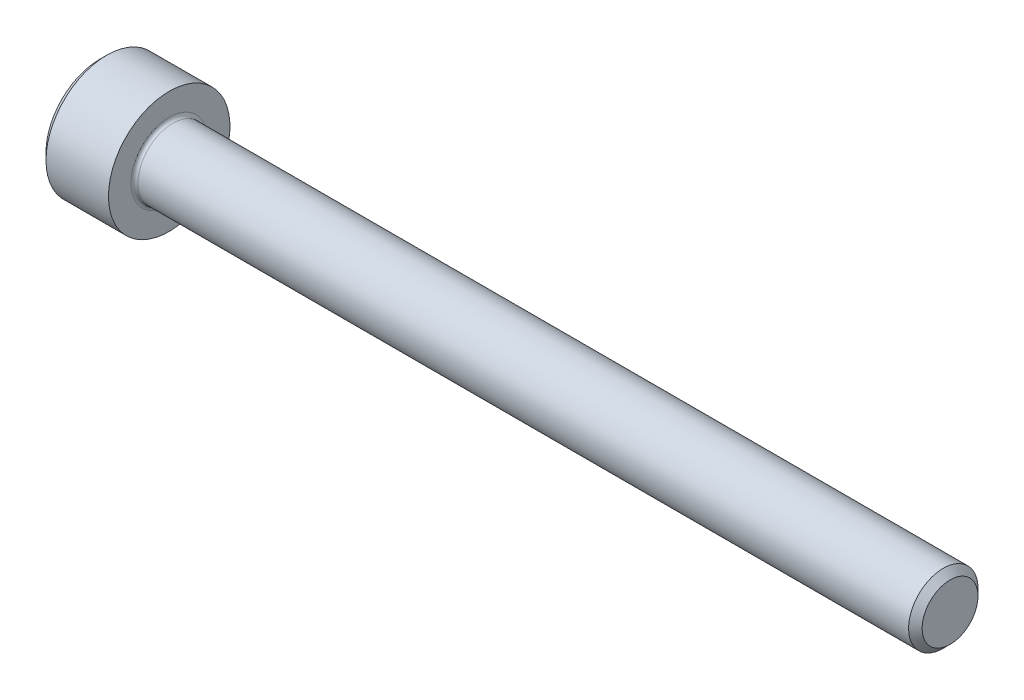
ISO-10303-21;
HEADER;
FILE_DESCRIPTION(('STEP AP214'),'2;1');
FILE_NAME('part.step','',(''),(''),'','','');
FILE_SCHEMA(('AUTOMOTIVE_DESIGN { 1 0 10303 214 1 1 1 1 }'));
ENDSEC;
DATA;
#1=APPLICATION_CONTEXT('core data for automotive mechanical design processes');
#2=APPLICATION_PROTOCOL_DEFINITION('international standard','automotive_design',2000,#1);
#3=PRODUCT_CONTEXT('',#1,'mechanical');
#4=PRODUCT('Part','Part','',(#3));
#5=PRODUCT_RELATED_PRODUCT_CATEGORY('part','',(#4));
#6=PRODUCT_DEFINITION_FORMATION('','',#4);
#7=PRODUCT_DEFINITION_CONTEXT('part definition',#1,'design');
#8=PRODUCT_DEFINITION('design','',#6,#7);
#9=PRODUCT_DEFINITION_SHAPE('','',#8);
#10=(LENGTH_UNIT() NAMED_UNIT(*) SI_UNIT(.MILLI.,.METRE.));
#11=(NAMED_UNIT(*) PLANE_ANGLE_UNIT() SI_UNIT($,.RADIAN.));
#12=(NAMED_UNIT(*) SI_UNIT($,.STERADIAN.) SOLID_ANGLE_UNIT());
#13=UNCERTAINTY_MEASURE_WITH_UNIT(LENGTH_MEASURE(1.E-05),#10,'distance_accuracy_value','');
#14=(GEOMETRIC_REPRESENTATION_CONTEXT(3) GLOBAL_UNCERTAINTY_ASSIGNED_CONTEXT((#13)) GLOBAL_UNIT_ASSIGNED_CONTEXT((#10,
#11,#12)) REPRESENTATION_CONTEXT('',''));
#15=CARTESIAN_POINT('',(0.,0.,0.));
#16=DIRECTION('',(0.,0.,1.));
#17=DIRECTION('',(1.,0.,0.));
#18=AXIS2_PLACEMENT_3D('',#15,#16,#17);
#19=CARTESIAN_POINT('',(2.00000000012324,0.,0.));
#20=DIRECTION('',(-1.,0.,0.));
#21=DIRECTION('',(0.,0.,1.));
#22=AXIS2_PLACEMENT_3D('',#19,#20,#21);
#23=CONICAL_SURFACE('',#22,1.53549999976121,1.04719755097356);
#24=CARTESIAN_POINT('',(2.88652133838241,0.,3.12638803734444E-10));
#25=VERTEX_POINT('',#24);
#26=VERTEX_LOOP('',#25);
#27=FACE_BOUND('',#26,.T.);
#28=CARTESIAN_POINT('',(1.99999999999196,0.,0.));
#29=DIRECTION('',(-1.,0.,0.));
#30=DIRECTION('',(0.,0.,1.));
#31=AXIS2_PLACEMENT_3D('',#28,#29,#30);
#32=CIRCLE('',#31,1.53549999998859);
#33=CARTESIAN_POINT('',(1.99999999999837,0.,1.53549999999715));
#34=VERTEX_POINT('',#33);
#35=CARTESIAN_POINT('',(1.99999999999598,-1.32978200750606,0.767749999997149));
#36=VERTEX_POINT('',#35);
#37=EDGE_CURVE('E96',#34,#36,#32,.F.);
#38=ORIENTED_EDGE('',*,*,#37,.F.);
#39=CARTESIAN_POINT('',(1.99999999999196,0.,0.));
#40=DIRECTION('',(-1.,0.,0.));
#41=DIRECTION('',(0.,0.,1.));
#42=AXIS2_PLACEMENT_3D('',#39,#40,#41);
#43=CIRCLE('',#42,1.53549999998859);
#44=CARTESIAN_POINT('',(1.99999999999598,1.32978200750606,0.767749999997144));
#45=VERTEX_POINT('',#44);
#46=EDGE_CURVE('E99',#45,#34,#43,.F.);
#47=ORIENTED_EDGE('',*,*,#46,.F.);
#48=CARTESIAN_POINT('',(1.99999999999196,0.,0.));
#49=DIRECTION('',(-1.,0.,0.));
#50=DIRECTION('',(0.,0.,1.));
#51=AXIS2_PLACEMENT_3D('',#48,#49,#50);
#52=CIRCLE('',#51,1.53549999998859);
#53=CARTESIAN_POINT('',(1.99999999999598,1.32978200750606,-0.767749999997148));
#54=VERTEX_POINT('',#53);
#55=EDGE_CURVE('E121',#54,#45,#52,.F.);
#56=ORIENTED_EDGE('',*,*,#55,.F.);
#57=CARTESIAN_POINT('',(1.99999999999196,0.,0.));
#58=DIRECTION('',(-1.,0.,0.));
#59=DIRECTION('',(0.,0.,1.));
#60=AXIS2_PLACEMENT_3D('',#57,#58,#59);
#61=CIRCLE('',#60,1.53549999998859);
#62=CARTESIAN_POINT('',(1.99999999999837,0.,-1.53549999999144));
#63=VERTEX_POINT('',#62);
#64=EDGE_CURVE('E155',#63,#54,#61,.F.);
#65=ORIENTED_EDGE('',*,*,#64,.F.);
#66=CARTESIAN_POINT('',(1.99999999999196,0.,0.));
#67=DIRECTION('',(-1.,0.,0.));
#68=DIRECTION('',(0.,0.,1.));
#69=AXIS2_PLACEMENT_3D('',#66,#67,#68);
#70=CIRCLE('',#69,1.53549999998859);
#71=CARTESIAN_POINT('',(1.99999999999598,-1.32978200750607,-0.767749999997147));
#72=VERTEX_POINT('',#71);
#73=EDGE_CURVE('E122',#72,#63,#70,.F.);
#74=ORIENTED_EDGE('',*,*,#73,.F.);
#75=CARTESIAN_POINT('',(1.99999999999196,0.,0.));
#76=DIRECTION('',(-1.,0.,0.));
#77=DIRECTION('',(0.,0.,1.));
#78=AXIS2_PLACEMENT_3D('',#75,#76,#77);
#79=CIRCLE('',#78,1.53549999998859);
#80=EDGE_CURVE('E102',#36,#72,#79,.F.);
#81=ORIENTED_EDGE('',*,*,#80,.F.);
#82=EDGE_LOOP('',(#38,#47,#56,#65,#74,#81));
#83=FACE_BOUND('',#82,.T.);
#84=ADVANCED_FACE('F17',(#27,#83),#23,.F.);
#85=CARTESIAN_POINT('',(2.,0.886521338340669,1.5355));
#86=DIRECTION('',(-1.,0.,0.));
#87=DIRECTION('',(0.,0.,1.));
#88=AXIS2_PLACEMENT_3D('',#85,#86,#87);
#89=PLANE('',#88);
#90=DIRECTION('',(0.,-1.,0.));
#91=VECTOR('',#90,1.);
#92=CARTESIAN_POINT('',(2.,-0.886521338340672,1.5355));
#93=LINE('',#92,#91);
#94=CARTESIAN_POINT('',(2.,0.88652133834067,1.5355));
#95=VERTEX_POINT('',#94);
#96=EDGE_CURVE('E113',#34,#95,#93,.F.);
#97=ORIENTED_EDGE('',*,*,#96,.T.);
#98=DIRECTION('',(0.,0.499999999999999,-0.86602540378444));
#99=VECTOR('',#98,1.);
#100=CARTESIAN_POINT('',(2.,1.77304267668134,0.));
#101=LINE('',#100,#99);
#102=EDGE_CURVE('E114',#45,#95,#101,.F.);
#103=ORIENTED_EDGE('',*,*,#102,.F.);
#104=ORIENTED_EDGE('',*,*,#46,.T.);
#105=EDGE_LOOP('',(#97,#103,#104));
#106=FACE_BOUND('',#105,.T.);
#107=ADVANCED_FACE('F118',(#106),#89,.T.);
#108=CARTESIAN_POINT('',(2.,0.886521338340669,1.5355));
#109=DIRECTION('',(-1.,0.,0.));
#110=DIRECTION('',(0.,0.,1.));
#111=AXIS2_PLACEMENT_3D('',#108,#109,#110);
#112=PLANE('',#111);
#113=DIRECTION('',(0.,0.500000000000001,0.866025403784438));
#114=VECTOR('',#113,1.);
#115=CARTESIAN_POINT('',(2.,-0.886521338340672,1.5355));
#116=LINE('',#115,#114);
#117=CARTESIAN_POINT('',(2.,-0.886521338340672,1.5355));
#118=VERTEX_POINT('',#117);
#119=EDGE_CURVE('E109',#118,#36,#116,.F.);
#120=ORIENTED_EDGE('',*,*,#119,.F.);
#121=DIRECTION('',(0.,-1.,0.));
#122=VECTOR('',#121,1.);
#123=CARTESIAN_POINT('',(2.,-0.886521338340672,1.5355));
#124=LINE('',#123,#122);
#125=EDGE_CURVE('E107',#118,#34,#124,.F.);
#126=ORIENTED_EDGE('',*,*,#125,.T.);
#127=ORIENTED_EDGE('',*,*,#37,.T.);
#128=EDGE_LOOP('',(#120,#126,#127));
#129=FACE_BOUND('',#128,.T.);
#130=ADVANCED_FACE('F108',(#129),#112,.T.);
#131=CARTESIAN_POINT('',(2.,0.886521338340669,1.5355));
#132=DIRECTION('',(-1.,0.,0.));
#133=DIRECTION('',(0.,0.,1.));
#134=AXIS2_PLACEMENT_3D('',#131,#132,#133);
#135=PLANE('',#134);
#136=DIRECTION('',(0.,-0.499999999999999,0.86602540378444));
#137=VECTOR('',#136,1.);
#138=CARTESIAN_POINT('',(2.,-1.77304267668134,0.));
#139=LINE('',#138,#137);
#140=CARTESIAN_POINT('',(2.,-1.77304267668134,0.));
#141=VERTEX_POINT('',#140);
#142=EDGE_CURVE('E415',#141,#72,#139,.F.);
#143=ORIENTED_EDGE('',*,*,#142,.F.);
#144=DIRECTION('',(0.,0.500000000000001,0.866025403784438));
#145=VECTOR('',#144,1.);
#146=CARTESIAN_POINT('',(2.,-0.886521338340672,1.5355));
#147=LINE('',#146,#145);
#148=EDGE_CURVE('E417',#36,#141,#147,.F.);
#149=ORIENTED_EDGE('',*,*,#148,.F.);
#150=ORIENTED_EDGE('',*,*,#80,.T.);
#151=EDGE_LOOP('',(#143,#149,#150));
#152=FACE_BOUND('',#151,.T.);
#153=ADVANCED_FACE('F276',(#152),#135,.T.);
#154=CARTESIAN_POINT('',(2.,0.886521338340669,1.5355));
#155=DIRECTION('',(-1.,0.,0.));
#156=DIRECTION('',(0.,0.,1.));
#157=AXIS2_PLACEMENT_3D('',#154,#155,#156);
#158=PLANE('',#157);
#159=DIRECTION('',(0.,1.,0.));
#160=VECTOR('',#159,1.);
#161=CARTESIAN_POINT('',(2.,0.886521338340665,-1.5355));
#162=LINE('',#161,#160);
#163=CARTESIAN_POINT('',(2.,-0.886521338340676,-1.5355));
#164=VERTEX_POINT('',#163);
#165=EDGE_CURVE('E471',#63,#164,#162,.F.);
#166=ORIENTED_EDGE('',*,*,#165,.T.);
#167=DIRECTION('',(0.,-0.499999999999999,0.86602540378444));
#168=VECTOR('',#167,1.);
#169=CARTESIAN_POINT('',(2.,-1.77304267668134,0.));
#170=LINE('',#169,#168);
#171=EDGE_CURVE('E420',#72,#164,#170,.F.);
#172=ORIENTED_EDGE('',*,*,#171,.F.);
#173=ORIENTED_EDGE('',*,*,#73,.T.);
#174=EDGE_LOOP('',(#166,#172,#173));
#175=FACE_BOUND('',#174,.T.);
#176=ADVANCED_FACE('F272',(#175),#158,.T.);
#177=CARTESIAN_POINT('',(2.,0.886521338340669,1.5355));
#178=DIRECTION('',(-1.,0.,0.));
#179=DIRECTION('',(0.,0.,1.));
#180=AXIS2_PLACEMENT_3D('',#177,#178,#179);
#181=PLANE('',#180);
#182=DIRECTION('',(0.,0.499999999999999,-0.86602540378444));
#183=VECTOR('',#182,1.);
#184=CARTESIAN_POINT('',(2.,1.77304267668134,0.));
#185=LINE('',#184,#183);
#186=CARTESIAN_POINT('',(2.,1.77304267668134,0.));
#187=VERTEX_POINT('',#186);
#188=EDGE_CURVE('E138',#187,#45,#185,.F.);
#189=ORIENTED_EDGE('',*,*,#188,.F.);
#190=DIRECTION('',(0.,0.500000000000001,0.866025403784438));
#191=VECTOR('',#190,1.);
#192=CARTESIAN_POINT('',(2.,1.77304267668134,0.));
#193=LINE('',#192,#191);
#194=EDGE_CURVE('E486',#187,#54,#193,.F.);
#195=ORIENTED_EDGE('',*,*,#194,.T.);
#196=ORIENTED_EDGE('',*,*,#55,.T.);
#197=EDGE_LOOP('',(#189,#195,#196));
#198=FACE_BOUND('',#197,.T.);
#199=ADVANCED_FACE('F268',(#198),#181,.T.);
#200=CARTESIAN_POINT('',(2.,0.886521338340669,1.5355));
#201=DIRECTION('',(-1.,0.,0.));
#202=DIRECTION('',(0.,0.,1.));
#203=AXIS2_PLACEMENT_3D('',#200,#201,#202);
#204=PLANE('',#203);
#205=DIRECTION('',(0.,0.500000000000001,0.866025403784438));
#206=VECTOR('',#205,1.);
#207=CARTESIAN_POINT('',(2.,1.77304267668134,0.));
#208=LINE('',#207,#206);
#209=CARTESIAN_POINT('',(2.,0.886521338340665,-1.5355));
#210=VERTEX_POINT('',#209);
#211=EDGE_CURVE('E460',#54,#210,#208,.F.);
#212=ORIENTED_EDGE('',*,*,#211,.T.);
#213=DIRECTION('',(0.,1.,0.));
#214=VECTOR('',#213,1.);
#215=CARTESIAN_POINT('',(2.,0.886521338340665,-1.5355));
#216=LINE('',#215,#214);
#217=EDGE_CURVE('E474',#210,#63,#216,.F.);
#218=ORIENTED_EDGE('',*,*,#217,.T.);
#219=ORIENTED_EDGE('',*,*,#64,.T.);
#220=EDGE_LOOP('',(#212,#218,#219));
#221=FACE_BOUND('',#220,.T.);
#222=ADVANCED_FACE('F264',(#221),#204,.T.);
#223=CARTESIAN_POINT('',(2.,1.77304267668134,0.));
#224=DIRECTION('',(0.,-0.86602540378444,-0.499999999999999));
#225=DIRECTION('',(0.,0.499999999999999,-0.86602540378444));
#226=AXIS2_PLACEMENT_3D('',#223,#224,#225);
#227=PLANE('',#226);
#228=ORIENTED_EDGE('',*,*,#102,.T.);
#229=DIRECTION('',(1.,0.,0.));
#230=VECTOR('',#229,1.);
#231=CARTESIAN_POINT('',(2.,0.88652133834067,1.5355));
#232=LINE('',#231,#230);
#233=CARTESIAN_POINT('',(0.,0.88652133834067,1.5355));
#234=VERTEX_POINT('',#233);
#235=EDGE_CURVE('E127',#95,#234,#232,.F.);
#236=ORIENTED_EDGE('',*,*,#235,.T.);
#237=DIRECTION('',(0.,-0.499999999999999,0.866025403784439));
#238=VECTOR('',#237,1.);
#239=CARTESIAN_POINT('',(0.,1.77304267668134,0.));
#240=LINE('',#239,#238);
#241=CARTESIAN_POINT('',(0.,1.77304267668134,0.));
#242=VERTEX_POINT('',#241);
#243=EDGE_CURVE('E454',#242,#234,#240,.T.);
#244=ORIENTED_EDGE('',*,*,#243,.F.);
#245=DIRECTION('',(1.,0.,0.));
#246=VECTOR('',#245,1.);
#247=CARTESIAN_POINT('',(2.,1.77304267668134,0.));
#248=LINE('',#247,#246);
#249=EDGE_CURVE('E481',#242,#187,#248,.T.);
#250=ORIENTED_EDGE('',*,*,#249,.T.);
#251=ORIENTED_EDGE('',*,*,#188,.T.);
#252=EDGE_LOOP('',(#228,#236,#244,#250,#251));
#253=FACE_BOUND('',#252,.T.);
#254=ADVANCED_FACE('F261',(#253),#227,.T.);
#255=CARTESIAN_POINT('',(2.,-0.886521338340672,1.5355));
#256=DIRECTION('',(0.,0.,1.));
#257=DIRECTION('',(0.,-1.,0.));
#258=AXIS2_PLACEMENT_3D('',#255,#256,#257);
#259=PLANE('',#258);
#260=ORIENTED_EDGE('',*,*,#235,.F.);
#261=ORIENTED_EDGE('',*,*,#96,.F.);
#262=ORIENTED_EDGE('',*,*,#125,.F.);
#263=DIRECTION('',(1.,0.,0.));
#264=VECTOR('',#263,1.);
#265=CARTESIAN_POINT('',(2.,-0.886521338340672,1.5355));
#266=LINE('',#265,#264);
#267=CARTESIAN_POINT('',(0.,-0.886521338340672,1.5355));
#268=VERTEX_POINT('',#267);
#269=EDGE_CURVE('E129',#268,#118,#266,.T.);
#270=ORIENTED_EDGE('',*,*,#269,.F.);
#271=DIRECTION('',(0.,1.,0.));
#272=VECTOR('',#271,1.);
#273=CARTESIAN_POINT('',(0.,0.,1.5355));
#274=LINE('',#273,#272);
#275=EDGE_CURVE('E443',#234,#268,#274,.F.);
#276=ORIENTED_EDGE('',*,*,#275,.F.);
#277=EDGE_LOOP('',(#260,#261,#262,#270,#276));
#278=FACE_BOUND('',#277,.T.);
#279=ADVANCED_FACE('F125',(#278),#259,.F.);
#280=CARTESIAN_POINT('',(2.,-0.886521338340672,1.5355));
#281=DIRECTION('',(0.,0.866025403784438,-0.500000000000001));
#282=DIRECTION('',(0.,0.500000000000001,0.866025403784438));
#283=AXIS2_PLACEMENT_3D('',#280,#281,#282);
#284=PLANE('',#283);
#285=ORIENTED_EDGE('',*,*,#148,.T.);
#286=DIRECTION('',(1.,0.,0.));
#287=VECTOR('',#286,1.);
#288=CARTESIAN_POINT('',(2.,-1.77304267668134,0.));
#289=LINE('',#288,#287);
#290=CARTESIAN_POINT('',(0.,-1.77304267668134,0.));
#291=VERTEX_POINT('',#290);
#292=EDGE_CURVE('E421',#291,#141,#289,.T.);
#293=ORIENTED_EDGE('',*,*,#292,.F.);
#294=DIRECTION('',(0.,-0.500000000000001,-0.866025403784438));
#295=VECTOR('',#294,1.);
#296=CARTESIAN_POINT('',(0.,-0.886521338340672,1.5355));
#297=LINE('',#296,#295);
#298=EDGE_CURVE('E439',#268,#291,#297,.T.);
#299=ORIENTED_EDGE('',*,*,#298,.F.);
#300=ORIENTED_EDGE('',*,*,#269,.T.);
#301=ORIENTED_EDGE('',*,*,#119,.T.);
#302=EDGE_LOOP('',(#285,#293,#299,#300,#301));
#303=FACE_BOUND('',#302,.T.);
#304=ADVANCED_FACE('F254',(#303),#284,.T.);
#305=CARTESIAN_POINT('',(2.,-1.77304267668134,0.));
#306=DIRECTION('',(0.,0.86602540378444,0.499999999999999));
#307=DIRECTION('',(0.,-0.499999999999999,0.86602540378444));
#308=AXIS2_PLACEMENT_3D('',#305,#306,#307);
#309=PLANE('',#308);
#310=ORIENTED_EDGE('',*,*,#171,.T.);
#311=DIRECTION('',(1.,0.,0.));
#312=VECTOR('',#311,1.);
#313=CARTESIAN_POINT('',(2.,-0.886521338340676,-1.5355));
#314=LINE('',#313,#312);
#315=CARTESIAN_POINT('',(0.,-0.886521338340676,-1.5355));
#316=VERTEX_POINT('',#315);
#317=EDGE_CURVE('E473',#164,#316,#314,.F.);
#318=ORIENTED_EDGE('',*,*,#317,.T.);
#319=DIRECTION('',(0.,0.499999999999999,-0.86602540378444));
#320=VECTOR('',#319,1.);
#321=CARTESIAN_POINT('',(0.,-1.77304267668134,0.));
#322=LINE('',#321,#320);
#323=EDGE_CURVE('E425',#291,#316,#322,.T.);
#324=ORIENTED_EDGE('',*,*,#323,.F.);
#325=ORIENTED_EDGE('',*,*,#292,.T.);
#326=ORIENTED_EDGE('',*,*,#142,.T.);
#327=EDGE_LOOP('',(#310,#318,#324,#325,#326));
#328=FACE_BOUND('',#327,.T.);
#329=ADVANCED_FACE('F250',(#328),#309,.T.);
#330=CARTESIAN_POINT('',(2.,0.886521338340665,-1.5355));
#331=DIRECTION('',(0.,0.,-1.));
#332=DIRECTION('',(0.,1.,0.));
#333=AXIS2_PLACEMENT_3D('',#330,#331,#332);
#334=PLANE('',#333);
#335=ORIENTED_EDGE('',*,*,#317,.F.);
#336=ORIENTED_EDGE('',*,*,#165,.F.);
#337=ORIENTED_EDGE('',*,*,#217,.F.);
#338=DIRECTION('',(1.,0.,0.));
#339=VECTOR('',#338,1.);
#340=CARTESIAN_POINT('',(2.,0.886521338340665,-1.5355));
#341=LINE('',#340,#339);
#342=CARTESIAN_POINT('',(0.,0.886521338340666,-1.5355));
#343=VERTEX_POINT('',#342);
#344=EDGE_CURVE('E457',#210,#343,#341,.F.);
#345=ORIENTED_EDGE('',*,*,#344,.T.);
#346=DIRECTION('',(0.,1.,0.));
#347=VECTOR('',#346,1.);
#348=CARTESIAN_POINT('',(0.,0.,-1.5355));
#349=LINE('',#348,#347);
#350=EDGE_CURVE('E438',#316,#343,#349,.T.);
#351=ORIENTED_EDGE('',*,*,#350,.F.);
#352=EDGE_LOOP('',(#335,#336,#337,#345,#351));
#353=FACE_BOUND('',#352,.T.);
#354=ADVANCED_FACE('F246',(#353),#334,.F.);
#355=CARTESIAN_POINT('',(2.,1.77304267668134,0.));
#356=DIRECTION('',(0.,0.866025403784438,-0.500000000000001));
#357=DIRECTION('',(0.,0.500000000000001,0.866025403784438));
#358=AXIS2_PLACEMENT_3D('',#355,#356,#357);
#359=PLANE('',#358);
#360=ORIENTED_EDGE('',*,*,#344,.F.);
#361=ORIENTED_EDGE('',*,*,#211,.F.);
#362=ORIENTED_EDGE('',*,*,#194,.F.);
#363=ORIENTED_EDGE('',*,*,#249,.F.);
#364=DIRECTION('',(0.,0.500000000000001,0.866025403784438));
#365=VECTOR('',#364,1.);
#366=CARTESIAN_POINT('',(0.,0.886521338340665,-1.5355));
#367=LINE('',#366,#365);
#368=EDGE_CURVE('E154',#343,#242,#367,.T.);
#369=ORIENTED_EDGE('',*,*,#368,.F.);
#370=EDGE_LOOP('',(#360,#361,#362,#363,#369));
#371=FACE_BOUND('',#370,.T.);
#372=ADVANCED_FACE('F242',(#371),#359,.F.);
#373=CARTESIAN_POINT('',(0.,0.,0.));
#374=DIRECTION('',(-1.,0.,0.));
#375=DIRECTION('',(0.,0.,1.));
#376=AXIS2_PLACEMENT_3D('',#373,#374,#375);
#377=PLANE('',#376);
#378=CARTESIAN_POINT('',(0.,0.,0.));
#379=DIRECTION('',(1.,0.,0.));
#380=DIRECTION('',(0.,0.,-1.));
#381=AXIS2_PLACEMENT_3D('',#378,#379,#380);
#382=CIRCLE('',#381,3.10000000007449);
#383=CARTESIAN_POINT('',(0.,0.,-3.10000000007449));
#384=VERTEX_POINT('',#383);
#385=EDGE_CURVE('E151',#384,#384,#382,.T.);
#386=ORIENTED_EDGE('',*,*,#385,.F.);
#387=EDGE_LOOP('',(#386));
#388=FACE_BOUND('',#387,.T.);
#389=ORIENTED_EDGE('',*,*,#350,.T.);
#390=ORIENTED_EDGE('',*,*,#368,.T.);
#391=ORIENTED_EDGE('',*,*,#243,.T.);
#392=ORIENTED_EDGE('',*,*,#275,.T.);
#393=ORIENTED_EDGE('',*,*,#298,.T.);
#394=ORIENTED_EDGE('',*,*,#323,.T.);
#395=EDGE_LOOP('',(#389,#390,#391,#392,#393,#394));
#396=FACE_BOUND('',#395,.T.);
#397=ADVANCED_FACE('F234',(#388,#396),#377,.T.);
#398=CARTESIAN_POINT('',(0.400000000013279,0.,0.));
#399=DIRECTION('',(1.,0.,0.));
#400=DIRECTION('',(0.,0.,-1.));
#401=AXIS2_PLACEMENT_3D('',#398,#399,#400);
#402=CONICAL_SURFACE('',#401,3.50000000003092,0.785398163326394);
#403=ORIENTED_EDGE('',*,*,#385,.T.);
#404=EDGE_LOOP('',(#403));
#405=FACE_BOUND('',#404,.T.);
#406=CARTESIAN_POINT('',(0.399999999999998,0.,0.));
#407=DIRECTION('',(-1.,0.,0.));
#408=DIRECTION('',(0.,0.,1.));
#409=AXIS2_PLACEMENT_3D('',#406,#407,#408);
#410=CIRCLE('',#409,3.5);
#411=CARTESIAN_POINT('',(0.399999999999998,0.,3.5));
#412=VERTEX_POINT('',#411);
#413=EDGE_CURVE('E150',#412,#412,#410,.F.);
#414=ORIENTED_EDGE('',*,*,#413,.F.);
#415=EDGE_LOOP('',(#414));
#416=FACE_BOUND('',#415,.T.);
#417=ADVANCED_FACE('F229',(#405,#416),#402,.T.);
#418=CARTESIAN_POINT('',(-31.75,0.,0.));
#419=DIRECTION('',(-1.,0.,0.));
#420=DIRECTION('',(0.,0.,1.));
#421=AXIS2_PLACEMENT_3D('',#418,#419,#420);
#422=CYLINDRICAL_SURFACE('',#421,3.5);
#423=CARTESIAN_POINT('',(4.,0.,0.));
#424=DIRECTION('',(-1.,0.,0.));
#425=DIRECTION('',(0.,0.,1.));
#426=AXIS2_PLACEMENT_3D('',#423,#424,#425);
#427=CIRCLE('',#426,3.5);
#428=CARTESIAN_POINT('',(4.,0.,3.5));
#429=VERTEX_POINT('',#428);
#430=EDGE_CURVE('E147',#429,#429,#427,.F.);
#431=ORIENTED_EDGE('',*,*,#430,.F.);
#432=EDGE_LOOP('',(#431));
#433=FACE_BOUND('',#432,.T.);
#434=ORIENTED_EDGE('',*,*,#413,.T.);
#435=EDGE_LOOP('',(#434));
#436=FACE_BOUND('',#435,.T.);
#437=ADVANCED_FACE('F225',(#433,#436),#422,.T.);
#438=CARTESIAN_POINT('',(49.,1.61,0.));
#439=DIRECTION('',(1.,0.,0.));
#440=DIRECTION('',(0.,0.,-1.));
#441=AXIS2_PLACEMENT_3D('',#438,#439,#440);
#442=PLANE('',#441);
#443=CARTESIAN_POINT('',(48.9999999999782,0.,0.));
#444=DIRECTION('',(-1.,0.,0.));
#445=DIRECTION('',(0.,0.,1.));
#446=AXIS2_PLACEMENT_3D('',#443,#444,#445);
#447=CIRCLE('',#446,1.61000000002787);
#448=CARTESIAN_POINT('',(48.9999999999782,0.,1.61000000002787));
#449=VERTEX_POINT('',#448);
#450=EDGE_CURVE('E143',#449,#449,#447,.T.);
#451=ORIENTED_EDGE('',*,*,#450,.F.);
#452=EDGE_LOOP('',(#451));
#453=FACE_BOUND('',#452,.T.);
#454=ADVANCED_FACE('F183',(#453),#442,.T.);
#455=CARTESIAN_POINT('',(4.,3.5,0.));
#456=DIRECTION('',(1.,0.,0.));
#457=DIRECTION('',(0.,0.,-1.));
#458=AXIS2_PLACEMENT_3D('',#455,#456,#457);
#459=PLANE('',#458);
#460=ORIENTED_EDGE('',*,*,#430,.T.);
#461=EDGE_LOOP('',(#460));
#462=FACE_BOUND('',#461,.T.);
#463=CARTESIAN_POINT('',(4.,0.,0.));
#464=DIRECTION('',(1.,0.,0.));
#465=DIRECTION('',(0.,0.,1.));
#466=AXIS2_PLACEMENT_3D('',#463,#464,#465);
#467=CIRCLE('',#466,2.19999999999996);
#468=CARTESIAN_POINT('',(4.,0.,-2.19999999999996));
#469=VERTEX_POINT('',#468);
#470=CARTESIAN_POINT('',(4.,0.,2.19999999999996));
#471=VERTEX_POINT('',#470);
#472=EDGE_CURVE('E146',#469,#471,#467,.F.);
#473=ORIENTED_EDGE('',*,*,#472,.T.);
#474=CARTESIAN_POINT('',(4.,0.,0.));
#475=DIRECTION('',(1.,0.,0.));
#476=DIRECTION('',(0.,0.,-1.));
#477=AXIS2_PLACEMENT_3D('',#474,#475,#476);
#478=CIRCLE('',#477,2.19999999999996);
#479=EDGE_CURVE('E36',#471,#469,#478,.F.);
#480=ORIENTED_EDGE('',*,*,#479,.T.);
#481=EDGE_LOOP('',(#473,#480));
#482=FACE_BOUND('',#481,.T.);
#483=ADVANCED_FACE('F164',(#462,#482),#459,.T.);
#484=CARTESIAN_POINT('',(48.6100000000533,0.,0.));
#485=DIRECTION('',(-1.,0.,0.));
#486=DIRECTION('',(0.,0.,1.));
#487=AXIS2_PLACEMENT_3D('',#484,#485,#486);
#488=CONICAL_SURFACE('',#487,2.00000000000955,0.785398163470325);
#489=CARTESIAN_POINT('',(48.6099999999999,0.,0.));
#490=DIRECTION('',(-1.,0.,0.));
#491=DIRECTION('',(0.,0.,1.));
#492=AXIS2_PLACEMENT_3D('',#489,#490,#491);
#493=CIRCLE('',#492,1.99999999999996);
#494=CARTESIAN_POINT('',(48.6099999999999,0.,1.99999999999996));
#495=VERTEX_POINT('',#494);
#496=EDGE_CURVE('E28',#495,#495,#493,.T.);
#497=ORIENTED_EDGE('',*,*,#496,.F.);
#498=EDGE_LOOP('',(#497));
#499=FACE_BOUND('',#498,.T.);
#500=ORIENTED_EDGE('',*,*,#450,.T.);
#501=EDGE_LOOP('',(#500));
#502=FACE_BOUND('',#501,.T.);
#503=ADVANCED_FACE('F182',(#499,#502),#488,.T.);
#504=CARTESIAN_POINT('',(4.2,0.,0.));
#505=DIRECTION('',(1.,0.,0.));
#506=DIRECTION('',(0.,0.,-1.));
#507=AXIS2_PLACEMENT_3D('',#504,#505,#506);
#508=TOROIDAL_SURFACE('',#507,2.19999999999996,0.2);
#509=CARTESIAN_POINT('',(4.2,0.,0.));
#510=DIRECTION('',(-1.,0.,0.));
#511=DIRECTION('',(0.,0.,1.));
#512=AXIS2_PLACEMENT_3D('',#509,#510,#511);
#513=CIRCLE('',#512,1.99999999999996);
#514=CARTESIAN_POINT('',(4.2,0.,1.99999999999996));
#515=VERTEX_POINT('',#514);
#516=EDGE_CURVE('E11',#515,#515,#513,.F.);
#517=ORIENTED_EDGE('',*,*,#516,.F.);
#518=EDGE_LOOP('',(#517));
#519=FACE_BOUND('',#518,.T.);
#520=ORIENTED_EDGE('',*,*,#472,.F.);
#521=ORIENTED_EDGE('',*,*,#479,.F.);
#522=EDGE_LOOP('',(#520,#521));
#523=FACE_BOUND('',#522,.T.);
#524=ADVANCED_FACE('F161',(#519,#523),#508,.F.);
#525=CARTESIAN_POINT('',(-31.75,0.,0.));
#526=DIRECTION('',(-1.,0.,0.));
#527=DIRECTION('',(0.,0.,1.));
#528=AXIS2_PLACEMENT_3D('',#525,#526,#527);
#529=CYLINDRICAL_SURFACE('',#528,1.99999999999996);
#530=ORIENTED_EDGE('',*,*,#516,.T.);
#531=EDGE_LOOP('',(#530));
#532=FACE_BOUND('',#531,.T.);
#533=ORIENTED_EDGE('',*,*,#496,.T.);
#534=EDGE_LOOP('',(#533));
#535=FACE_BOUND('',#534,.T.);
#536=ADVANCED_FACE('F207',(#532,#535),#529,.T.);
#537=CLOSED_SHELL('',(#84,#107,#130,#153,#176,#199,#222,#254,#279,#304,#329,#354,#372,#397,#417,
#437,#454,#483,#503,#524,#536));
#538=MANIFOLD_SOLID_BREP('B1',#537);
#539=ADVANCED_BREP_SHAPE_REPRESENTATION('',(#18,#538),#14);
#540=SHAPE_DEFINITION_REPRESENTATION(#9,#539);
ENDSEC;
END-ISO-10303-21;
